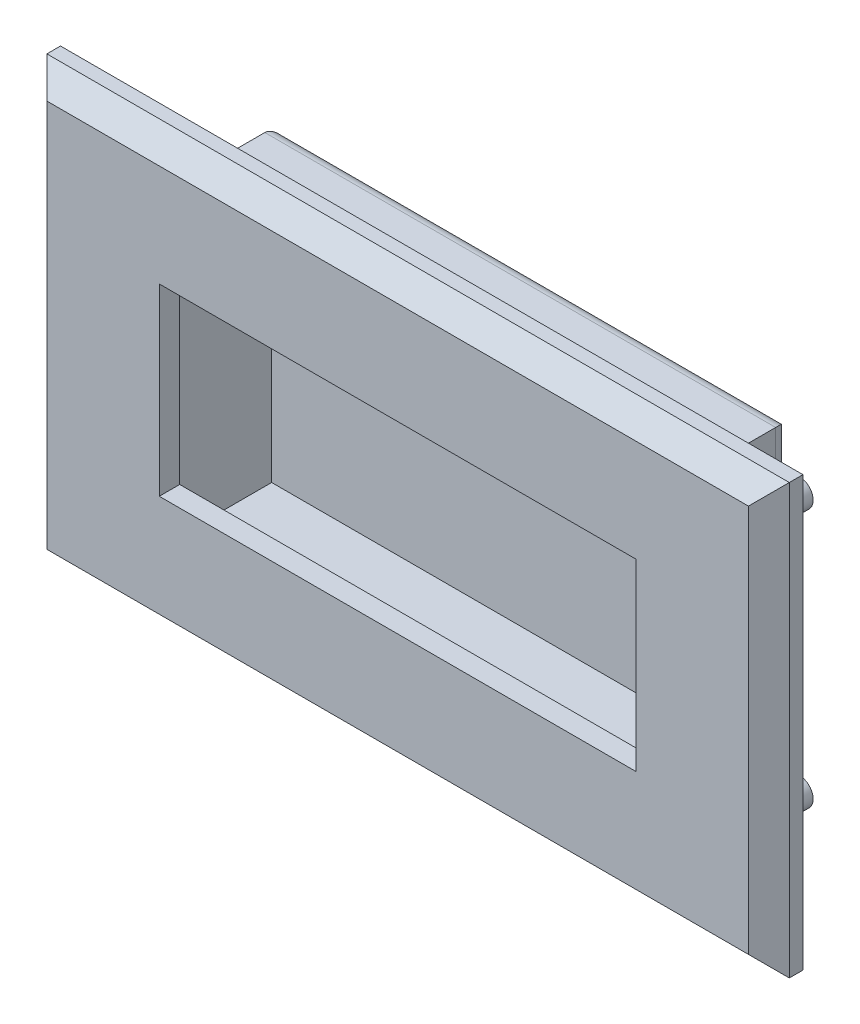
ISO-10303-21;
HEADER;
FILE_DESCRIPTION(('STEP AP214'),'2;1');
FILE_NAME('part.step','',(''),(''),'','','');
FILE_SCHEMA(('AUTOMOTIVE_DESIGN { 1 0 10303 214 1 1 1 1 }'));
ENDSEC;
DATA;
#1=APPLICATION_CONTEXT('core data for automotive mechanical design processes');
#2=APPLICATION_PROTOCOL_DEFINITION('international standard','automotive_design',2000,#1);
#3=PRODUCT_CONTEXT('',#1,'mechanical');
#4=PRODUCT('Part','Part','',(#3));
#5=PRODUCT_RELATED_PRODUCT_CATEGORY('part','',(#4));
#6=PRODUCT_DEFINITION_FORMATION('','',#4);
#7=PRODUCT_DEFINITION_CONTEXT('part definition',#1,'design');
#8=PRODUCT_DEFINITION('design','',#6,#7);
#9=PRODUCT_DEFINITION_SHAPE('','',#8);
#10=(LENGTH_UNIT() NAMED_UNIT(*) SI_UNIT(.MILLI.,.METRE.));
#11=(NAMED_UNIT(*) PLANE_ANGLE_UNIT() SI_UNIT($,.RADIAN.));
#12=(NAMED_UNIT(*) SI_UNIT($,.STERADIAN.) SOLID_ANGLE_UNIT());
#13=UNCERTAINTY_MEASURE_WITH_UNIT(LENGTH_MEASURE(1.E-05),#10,'distance_accuracy_value','');
#14=(GEOMETRIC_REPRESENTATION_CONTEXT(3) GLOBAL_UNCERTAINTY_ASSIGNED_CONTEXT((#13)) GLOBAL_UNIT_ASSIGNED_CONTEXT((#10,
#11,#12)) REPRESENTATION_CONTEXT('',''));
#15=CARTESIAN_POINT('',(0.,0.,0.));
#16=DIRECTION('',(0.,0.,1.));
#17=DIRECTION('',(1.,0.,0.));
#18=AXIS2_PLACEMENT_3D('',#15,#16,#17);
#19=CARTESIAN_POINT('',(35.,-13.5,-13.));
#20=DIRECTION('',(1.,0.,0.));
#21=DIRECTION('',(0.,0.,-1.));
#22=AXIS2_PLACEMENT_3D('',#19,#20,#21);
#23=PLANE('',#22);
#24=DIRECTION('',(0.,1.,0.));
#25=VECTOR('',#24,1.);
#26=CARTESIAN_POINT('',(35.,-13.5,2.));
#27=LINE('',#26,#25);
#28=CARTESIAN_POINT('',(35.,-13.5,2.));
#29=VERTEX_POINT('',#28);
#30=CARTESIAN_POINT('',(35.,13.5,2.));
#31=VERTEX_POINT('',#30);
#32=EDGE_CURVE('E221',#29,#31,#27,.T.);
#33=ORIENTED_EDGE('',*,*,#32,.F.);
#34=DIRECTION('',(0.,0.,1.));
#35=VECTOR('',#34,1.);
#36=CARTESIAN_POINT('',(35.,-13.5,-13.));
#37=LINE('',#36,#35);
#38=CARTESIAN_POINT('',(35.,-13.5,5.));
#39=VERTEX_POINT('',#38);
#40=EDGE_CURVE('E241',#29,#39,#37,.T.);
#41=ORIENTED_EDGE('',*,*,#40,.T.);
#42=DIRECTION('',(0.,1.,0.));
#43=VECTOR('',#42,1.);
#44=CARTESIAN_POINT('',(35.,-13.5,5.));
#45=LINE('',#44,#43);
#46=CARTESIAN_POINT('',(35.,13.5,5.));
#47=VERTEX_POINT('',#46);
#48=EDGE_CURVE('E224',#39,#47,#45,.T.);
#49=ORIENTED_EDGE('',*,*,#48,.T.);
#50=DIRECTION('',(0.,0.,1.));
#51=VECTOR('',#50,1.);
#52=CARTESIAN_POINT('',(35.,13.5,-13.));
#53=LINE('',#52,#51);
#54=EDGE_CURVE('E240',#31,#47,#53,.T.);
#55=ORIENTED_EDGE('',*,*,#54,.F.);
#56=EDGE_LOOP('',(#33,#41,#49,#55));
#57=FACE_BOUND('',#56,.T.);
#58=ADVANCED_FACE('F41',(#57),#23,.F.);
#59=CARTESIAN_POINT('',(-35.,-13.5,-13.));
#60=DIRECTION('',(0.,-1.,0.));
#61=DIRECTION('',(0.,0.,-1.));
#62=AXIS2_PLACEMENT_3D('',#59,#60,#61);
#63=PLANE('',#62);
#64=DIRECTION('',(1.,0.,0.));
#65=VECTOR('',#64,1.);
#66=CARTESIAN_POINT('',(-35.,-13.5,2.));
#67=LINE('',#66,#65);
#68=CARTESIAN_POINT('',(-35.,-13.5,2.));
#69=VERTEX_POINT('',#68);
#70=EDGE_CURVE('E213',#69,#29,#67,.T.);
#71=ORIENTED_EDGE('',*,*,#70,.F.);
#72=DIRECTION('',(0.,0.,1.));
#73=VECTOR('',#72,1.);
#74=CARTESIAN_POINT('',(-35.,-13.5,-13.));
#75=LINE('',#74,#73);
#76=CARTESIAN_POINT('',(-35.,-13.5,5.));
#77=VERTEX_POINT('',#76);
#78=EDGE_CURVE('E245',#69,#77,#75,.T.);
#79=ORIENTED_EDGE('',*,*,#78,.T.);
#80=DIRECTION('',(1.,0.,0.));
#81=VECTOR('',#80,1.);
#82=CARTESIAN_POINT('',(-35.,-13.5,5.));
#83=LINE('',#82,#81);
#84=EDGE_CURVE('E236',#77,#39,#83,.T.);
#85=ORIENTED_EDGE('',*,*,#84,.T.);
#86=ORIENTED_EDGE('',*,*,#40,.F.);
#87=EDGE_LOOP('',(#71,#79,#85,#86));
#88=FACE_BOUND('',#87,.T.);
#89=ADVANCED_FACE('F465',(#88),#63,.F.);
#90=CARTESIAN_POINT('',(-35.,-13.5,-13.));
#91=DIRECTION('',(-1.,0.,0.));
#92=DIRECTION('',(0.,0.,1.));
#93=AXIS2_PLACEMENT_3D('',#90,#91,#92);
#94=PLANE('',#93);
#95=DIRECTION('',(0.,-1.,0.));
#96=VECTOR('',#95,1.);
#97=CARTESIAN_POINT('',(-35.,-13.5,2.));
#98=LINE('',#97,#96);
#99=CARTESIAN_POINT('',(-35.,13.5,2.));
#100=VERTEX_POINT('',#99);
#101=EDGE_CURVE('E208',#100,#69,#98,.T.);
#102=ORIENTED_EDGE('',*,*,#101,.F.);
#103=DIRECTION('',(0.,0.,1.));
#104=VECTOR('',#103,1.);
#105=CARTESIAN_POINT('',(-35.,13.5,-13.));
#106=LINE('',#105,#104);
#107=CARTESIAN_POINT('',(-35.,13.5,5.));
#108=VERTEX_POINT('',#107);
#109=EDGE_CURVE('E248',#100,#108,#106,.T.);
#110=ORIENTED_EDGE('',*,*,#109,.T.);
#111=DIRECTION('',(0.,-1.,0.));
#112=VECTOR('',#111,1.);
#113=CARTESIAN_POINT('',(-35.,-13.5,5.));
#114=LINE('',#113,#112);
#115=EDGE_CURVE('E232',#108,#77,#114,.T.);
#116=ORIENTED_EDGE('',*,*,#115,.T.);
#117=ORIENTED_EDGE('',*,*,#78,.F.);
#118=EDGE_LOOP('',(#102,#110,#116,#117));
#119=FACE_BOUND('',#118,.T.);
#120=ADVANCED_FACE('F471',(#119),#94,.F.);
#121=CARTESIAN_POINT('',(-35.,13.5,-13.));
#122=DIRECTION('',(0.,1.,0.));
#123=DIRECTION('',(0.,0.,1.));
#124=AXIS2_PLACEMENT_3D('',#121,#122,#123);
#125=PLANE('',#124);
#126=DIRECTION('',(-1.,0.,0.));
#127=VECTOR('',#126,1.);
#128=CARTESIAN_POINT('',(-35.,13.5,2.));
#129=LINE('',#128,#127);
#130=EDGE_CURVE('E348',#31,#100,#129,.T.);
#131=ORIENTED_EDGE('',*,*,#130,.F.);
#132=ORIENTED_EDGE('',*,*,#54,.T.);
#133=DIRECTION('',(-1.,0.,0.));
#134=VECTOR('',#133,1.);
#135=CARTESIAN_POINT('',(-35.,13.5,5.));
#136=LINE('',#135,#134);
#137=EDGE_CURVE('E228',#47,#108,#136,.T.);
#138=ORIENTED_EDGE('',*,*,#137,.T.);
#139=ORIENTED_EDGE('',*,*,#109,.F.);
#140=EDGE_LOOP('',(#131,#132,#138,#139));
#141=FACE_BOUND('',#140,.T.);
#142=ADVANCED_FACE('F476',(#141),#125,.F.);
#143=CARTESIAN_POINT('',(54.5,-31.5,5.));
#144=DIRECTION('',(-1.,0.,0.));
#145=DIRECTION('',(0.,0.,1.));
#146=AXIS2_PLACEMENT_3D('',#143,#144,#145);
#147=PLANE('',#146);
#148=DIRECTION('',(0.,0.,-1.));
#149=VECTOR('',#148,1.);
#150=CARTESIAN_POINT('',(54.5,31.5,5.));
#151=LINE('',#150,#149);
#152=CARTESIAN_POINT('',(54.5,31.5,1.99999999999998));
#153=VERTEX_POINT('',#152);
#154=CARTESIAN_POINT('',(54.5,31.5,0.));
#155=VERTEX_POINT('',#154);
#156=EDGE_CURVE('E291',#153,#155,#151,.T.);
#157=ORIENTED_EDGE('',*,*,#156,.F.);
#158=DIRECTION('',(0.,-1.,0.));
#159=VECTOR('',#158,1.);
#160=CARTESIAN_POINT('',(54.5,-31.5,1.99999999999998));
#161=LINE('',#160,#159);
#162=CARTESIAN_POINT('',(54.5,-31.5,1.99999999999998));
#163=VERTEX_POINT('',#162);
#164=EDGE_CURVE('E307',#153,#163,#161,.T.);
#165=ORIENTED_EDGE('',*,*,#164,.T.);
#166=DIRECTION('',(0.,0.,-1.));
#167=VECTOR('',#166,1.);
#168=CARTESIAN_POINT('',(54.5,-31.5,5.));
#169=LINE('',#168,#167);
#170=CARTESIAN_POINT('',(54.5,-31.5,0.));
#171=VERTEX_POINT('',#170);
#172=EDGE_CURVE('E282',#163,#171,#169,.T.);
#173=ORIENTED_EDGE('',*,*,#172,.T.);
#174=DIRECTION('',(0.,1.,0.));
#175=VECTOR('',#174,1.);
#176=CARTESIAN_POINT('',(54.5,-31.5,0.));
#177=LINE('',#176,#175);
#178=EDGE_CURVE('E265',#171,#155,#177,.T.);
#179=ORIENTED_EDGE('',*,*,#178,.T.);
#180=EDGE_LOOP('',(#157,#165,#173,#179));
#181=FACE_BOUND('',#180,.T.);
#182=ADVANCED_FACE('F517',(#181),#147,.F.);
#183=CARTESIAN_POINT('',(-54.5,31.5,5.));
#184=DIRECTION('',(0.,-1.,0.));
#185=DIRECTION('',(0.,0.,-1.));
#186=AXIS2_PLACEMENT_3D('',#183,#184,#185);
#187=PLANE('',#186);
#188=DIRECTION('',(0.,0.,-1.));
#189=VECTOR('',#188,1.);
#190=CARTESIAN_POINT('',(-54.5,31.5,5.));
#191=LINE('',#190,#189);
#192=CARTESIAN_POINT('',(-54.5,31.5,1.99999999999998));
#193=VERTEX_POINT('',#192);
#194=CARTESIAN_POINT('',(-54.5,31.5,0.));
#195=VERTEX_POINT('',#194);
#196=EDGE_CURVE('E288',#193,#195,#191,.T.);
#197=ORIENTED_EDGE('',*,*,#196,.F.);
#198=DIRECTION('',(1.,0.,0.));
#199=VECTOR('',#198,1.);
#200=CARTESIAN_POINT('',(-54.5,31.5,1.99999999999998));
#201=LINE('',#200,#199);
#202=EDGE_CURVE('E317',#193,#153,#201,.T.);
#203=ORIENTED_EDGE('',*,*,#202,.T.);
#204=ORIENTED_EDGE('',*,*,#156,.T.);
#205=DIRECTION('',(-1.,0.,0.));
#206=VECTOR('',#205,1.);
#207=CARTESIAN_POINT('',(-54.5,31.5,0.));
#208=LINE('',#207,#206);
#209=EDGE_CURVE('E269',#155,#195,#208,.T.);
#210=ORIENTED_EDGE('',*,*,#209,.T.);
#211=EDGE_LOOP('',(#197,#203,#204,#210));
#212=FACE_BOUND('',#211,.T.);
#213=ADVANCED_FACE('F513',(#212),#187,.F.);
#214=CARTESIAN_POINT('',(-54.5,-31.5,5.));
#215=DIRECTION('',(1.,0.,0.));
#216=DIRECTION('',(0.,0.,-1.));
#217=AXIS2_PLACEMENT_3D('',#214,#215,#216);
#218=PLANE('',#217);
#219=DIRECTION('',(0.,0.,-1.));
#220=VECTOR('',#219,1.);
#221=CARTESIAN_POINT('',(-54.5,-31.5,5.));
#222=LINE('',#221,#220);
#223=CARTESIAN_POINT('',(-54.5,-31.5,1.99999999999998));
#224=VERTEX_POINT('',#223);
#225=CARTESIAN_POINT('',(-54.5,-31.5,0.));
#226=VERTEX_POINT('',#225);
#227=EDGE_CURVE('E285',#224,#226,#222,.T.);
#228=ORIENTED_EDGE('',*,*,#227,.F.);
#229=DIRECTION('',(0.,1.,0.));
#230=VECTOR('',#229,1.);
#231=CARTESIAN_POINT('',(-54.5,-31.5,1.99999999999998));
#232=LINE('',#231,#230);
#233=EDGE_CURVE('E314',#224,#193,#232,.T.);
#234=ORIENTED_EDGE('',*,*,#233,.T.);
#235=ORIENTED_EDGE('',*,*,#196,.T.);
#236=DIRECTION('',(0.,-1.,0.));
#237=VECTOR('',#236,1.);
#238=CARTESIAN_POINT('',(-54.5,-31.5,0.));
#239=LINE('',#238,#237);
#240=EDGE_CURVE('E274',#195,#226,#239,.T.);
#241=ORIENTED_EDGE('',*,*,#240,.T.);
#242=EDGE_LOOP('',(#228,#234,#235,#241));
#243=FACE_BOUND('',#242,.T.);
#244=ADVANCED_FACE('F509',(#243),#218,.F.);
#245=CARTESIAN_POINT('',(-54.5,-31.5,5.));
#246=DIRECTION('',(0.,1.,0.));
#247=DIRECTION('',(0.,0.,1.));
#248=AXIS2_PLACEMENT_3D('',#245,#246,#247);
#249=PLANE('',#248);
#250=ORIENTED_EDGE('',*,*,#172,.F.);
#251=DIRECTION('',(-1.,0.,0.));
#252=VECTOR('',#251,1.);
#253=CARTESIAN_POINT('',(-54.5,-31.5,1.99999999999998));
#254=LINE('',#253,#252);
#255=EDGE_CURVE('E311',#163,#224,#254,.T.);
#256=ORIENTED_EDGE('',*,*,#255,.T.);
#257=ORIENTED_EDGE('',*,*,#227,.T.);
#258=DIRECTION('',(1.,0.,0.));
#259=VECTOR('',#258,1.);
#260=CARTESIAN_POINT('',(-54.5,-31.5,0.));
#261=LINE('',#260,#259);
#262=EDGE_CURVE('E278',#226,#171,#261,.T.);
#263=ORIENTED_EDGE('',*,*,#262,.T.);
#264=EDGE_LOOP('',(#250,#256,#257,#263));
#265=FACE_BOUND('',#264,.T.);
#266=ADVANCED_FACE('F501',(#265),#249,.F.);
#267=CARTESIAN_POINT('',(0.,0.,5.));
#268=DIRECTION('',(0.,0.,-1.));
#269=DIRECTION('',(-1.,0.,0.));
#270=AXIS2_PLACEMENT_3D('',#267,#268,#269);
#271=PLANE('',#270);
#272=ORIENTED_EDGE('',*,*,#137,.F.);
#273=ORIENTED_EDGE('',*,*,#48,.F.);
#274=ORIENTED_EDGE('',*,*,#84,.F.);
#275=ORIENTED_EDGE('',*,*,#115,.F.);
#276=EDGE_LOOP('',(#272,#273,#274,#275));
#277=FACE_BOUND('',#276,.T.);
#278=DIRECTION('',(1.,0.,0.));
#279=VECTOR('',#278,1.);
#280=CARTESIAN_POINT('',(0.,-28.5,5.));
#281=LINE('',#280,#279);
#282=CARTESIAN_POINT('',(-51.5,-28.5,5.));
#283=VERTEX_POINT('',#282);
#284=CARTESIAN_POINT('',(51.5,-28.5,5.));
#285=VERTEX_POINT('',#284);
#286=EDGE_CURVE('E300',#283,#285,#281,.T.);
#287=ORIENTED_EDGE('',*,*,#286,.T.);
#288=DIRECTION('',(0.,1.,0.));
#289=VECTOR('',#288,1.);
#290=CARTESIAN_POINT('',(51.5,0.,5.));
#291=LINE('',#290,#289);
#292=CARTESIAN_POINT('',(51.5,28.5,5.));
#293=VERTEX_POINT('',#292);
#294=EDGE_CURVE('E303',#285,#293,#291,.T.);
#295=ORIENTED_EDGE('',*,*,#294,.T.);
#296=DIRECTION('',(-1.,0.,0.));
#297=VECTOR('',#296,1.);
#298=CARTESIAN_POINT('',(0.,28.5,5.));
#299=LINE('',#298,#297);
#300=CARTESIAN_POINT('',(-51.5,28.5,5.));
#301=VERTEX_POINT('',#300);
#302=EDGE_CURVE('E294',#293,#301,#299,.T.);
#303=ORIENTED_EDGE('',*,*,#302,.T.);
#304=DIRECTION('',(0.,-1.,0.));
#305=VECTOR('',#304,1.);
#306=CARTESIAN_POINT('',(-51.5,0.,5.));
#307=LINE('',#306,#305);
#308=EDGE_CURVE('E297',#301,#283,#307,.T.);
#309=ORIENTED_EDGE('',*,*,#308,.T.);
#310=EDGE_LOOP('',(#287,#295,#303,#309));
#311=FACE_BOUND('',#310,.T.);
#312=ADVANCED_FACE('F497',(#277,#311),#271,.F.);
#313=CARTESIAN_POINT('',(0.,0.,0.));
#314=DIRECTION('',(0.,0.,-1.));
#315=DIRECTION('',(-1.,0.,0.));
#316=AXIS2_PLACEMENT_3D('',#313,#314,#315);
#317=PLANE('',#316);
#318=CARTESIAN_POINT('',(44.,19.,0.));
#319=DIRECTION('',(0.,0.,-1.));
#320=DIRECTION('',(-1.,0.,0.));
#321=AXIS2_PLACEMENT_3D('',#318,#319,#320);
#322=CIRCLE('',#321,2.);
#323=CARTESIAN_POINT('',(42.,19.,0.));
#324=VERTEX_POINT('',#323);
#325=EDGE_CURVE('E385',#324,#324,#322,.T.);
#326=ORIENTED_EDGE('',*,*,#325,.F.);
#327=EDGE_LOOP('',(#326));
#328=FACE_BOUND('',#327,.T.);
#329=CARTESIAN_POINT('',(44.,-19.,0.));
#330=DIRECTION('',(0.,0.,-1.));
#331=DIRECTION('',(-1.,0.,0.));
#332=AXIS2_PLACEMENT_3D('',#329,#330,#331);
#333=CIRCLE('',#332,2.);
#334=CARTESIAN_POINT('',(42.,-19.,0.));
#335=VERTEX_POINT('',#334);
#336=EDGE_CURVE('E398',#335,#335,#333,.T.);
#337=ORIENTED_EDGE('',*,*,#336,.F.);
#338=EDGE_LOOP('',(#337));
#339=FACE_BOUND('',#338,.T.);
#340=CARTESIAN_POINT('',(-44.,-19.,0.));
#341=DIRECTION('',(0.,0.,-1.));
#342=DIRECTION('',(-1.,0.,0.));
#343=AXIS2_PLACEMENT_3D('',#340,#341,#342);
#344=CIRCLE('',#343,2.);
#345=CARTESIAN_POINT('',(-46.,-19.,0.));
#346=VERTEX_POINT('',#345);
#347=EDGE_CURVE('E405',#346,#346,#344,.T.);
#348=ORIENTED_EDGE('',*,*,#347,.F.);
#349=EDGE_LOOP('',(#348));
#350=FACE_BOUND('',#349,.T.);
#351=CARTESIAN_POINT('',(-44.,19.,0.));
#352=DIRECTION('',(0.,0.,-1.));
#353=DIRECTION('',(-1.,0.,0.));
#354=AXIS2_PLACEMENT_3D('',#351,#352,#353);
#355=CIRCLE('',#354,2.);
#356=CARTESIAN_POINT('',(-46.,19.,0.));
#357=VERTEX_POINT('',#356);
#358=EDGE_CURVE('E413',#357,#357,#355,.T.);
#359=ORIENTED_EDGE('',*,*,#358,.F.);
#360=EDGE_LOOP('',(#359));
#361=FACE_BOUND('',#360,.T.);
#362=DIRECTION('',(0.,-1.,0.));
#363=VECTOR('',#362,1.);
#364=CARTESIAN_POINT('',(37.5,0.,0.));
#365=LINE('',#364,#363);
#366=CARTESIAN_POINT('',(37.5,22.5,0.));
#367=VERTEX_POINT('',#366);
#368=CARTESIAN_POINT('',(37.5,-22.5,0.));
#369=VERTEX_POINT('',#368);
#370=EDGE_CURVE('E344',#367,#369,#365,.T.);
#371=ORIENTED_EDGE('',*,*,#370,.F.);
#372=DIRECTION('',(1.,0.,0.));
#373=VECTOR('',#372,1.);
#374=CARTESIAN_POINT('',(0.,22.5,0.));
#375=LINE('',#374,#373);
#376=CARTESIAN_POINT('',(-37.5,22.5,0.));
#377=VERTEX_POINT('',#376);
#378=EDGE_CURVE('E320',#377,#367,#375,.T.);
#379=ORIENTED_EDGE('',*,*,#378,.F.);
#380=DIRECTION('',(0.,1.,0.));
#381=VECTOR('',#380,1.);
#382=CARTESIAN_POINT('',(-37.5,0.,0.));
#383=LINE('',#382,#381);
#384=CARTESIAN_POINT('',(-37.5,-22.5,0.));
#385=VERTEX_POINT('',#384);
#386=EDGE_CURVE('E336',#385,#377,#383,.T.);
#387=ORIENTED_EDGE('',*,*,#386,.F.);
#388=DIRECTION('',(-1.,0.,0.));
#389=VECTOR('',#388,1.);
#390=CARTESIAN_POINT('',(0.,-22.5,0.));
#391=LINE('',#390,#389);
#392=EDGE_CURVE('E340',#369,#385,#391,.T.);
#393=ORIENTED_EDGE('',*,*,#392,.F.);
#394=EDGE_LOOP('',(#371,#379,#387,#393));
#395=FACE_BOUND('',#394,.T.);
#396=ORIENTED_EDGE('',*,*,#178,.F.);
#397=ORIENTED_EDGE('',*,*,#262,.F.);
#398=ORIENTED_EDGE('',*,*,#240,.F.);
#399=ORIENTED_EDGE('',*,*,#209,.F.);
#400=EDGE_LOOP('',(#396,#397,#398,#399));
#401=FACE_BOUND('',#400,.T.);
#402=ADVANCED_FACE('F500',(#328,#339,#350,#361,#395,#401),#317,.T.);
#403=CARTESIAN_POINT('',(-51.5,0.,5.));
#404=DIRECTION('',(0.707106781186551,0.,-0.707106781186544));
#405=DIRECTION('',(0.,-1.,0.));
#406=AXIS2_PLACEMENT_3D('',#403,#404,#405);
#407=PLANE('',#406);
#408=DIRECTION('',(0.577350269189624,-0.577350269189624,0.577350269189629));
#409=VECTOR('',#408,1.);
#410=CARTESIAN_POINT('',(-34.3333333333334,11.3333333333334,22.1666666666667));
#411=LINE('',#410,#409);
#412=EDGE_CURVE('E326',#193,#301,#411,.T.);
#413=ORIENTED_EDGE('',*,*,#412,.F.);
#414=ORIENTED_EDGE('',*,*,#233,.F.);
#415=DIRECTION('',(0.577350269189624,0.577350269189624,0.577350269189629));
#416=VECTOR('',#415,1.);
#417=CARTESIAN_POINT('',(-42.0000000000001,-19.0000000000001,14.5));
#418=LINE('',#417,#416);
#419=EDGE_CURVE('E270',#283,#224,#418,.F.);
#420=ORIENTED_EDGE('',*,*,#419,.F.);
#421=ORIENTED_EDGE('',*,*,#308,.F.);
#422=EDGE_LOOP('',(#413,#414,#420,#421));
#423=FACE_BOUND('',#422,.T.);
#424=ADVANCED_FACE('F505',(#423),#407,.F.);
#425=CARTESIAN_POINT('',(0.,-28.5,5.));
#426=DIRECTION('',(0.,0.707106781186551,-0.707106781186544));
#427=DIRECTION('',(1.,0.,0.));
#428=AXIS2_PLACEMENT_3D('',#425,#426,#427);
#429=PLANE('',#428);
#430=ORIENTED_EDGE('',*,*,#419,.T.);
#431=ORIENTED_EDGE('',*,*,#255,.F.);
#432=DIRECTION('',(-0.577350269189624,0.577350269189624,0.577350269189629));
#433=VECTOR('',#432,1.);
#434=CARTESIAN_POINT('',(34.3333333333334,-11.3333333333334,22.1666666666667));
#435=LINE('',#434,#433);
#436=EDGE_CURVE('E323',#285,#163,#435,.F.);
#437=ORIENTED_EDGE('',*,*,#436,.F.);
#438=ORIENTED_EDGE('',*,*,#286,.F.);
#439=EDGE_LOOP('',(#430,#431,#437,#438));
#440=FACE_BOUND('',#439,.T.);
#441=ADVANCED_FACE('F535',(#440),#429,.F.);
#442=CARTESIAN_POINT('',(0.,28.5,5.));
#443=DIRECTION('',(0.,-0.707106781186551,-0.707106781186544));
#444=DIRECTION('',(-1.,0.,0.));
#445=AXIS2_PLACEMENT_3D('',#442,#443,#444);
#446=PLANE('',#445);
#447=ORIENTED_EDGE('',*,*,#412,.T.);
#448=ORIENTED_EDGE('',*,*,#302,.F.);
#449=DIRECTION('',(0.577350269189624,0.577350269189624,-0.577350269189629));
#450=VECTOR('',#449,1.);
#451=CARTESIAN_POINT('',(34.3333333333334,11.3333333333334,22.1666666666667));
#452=LINE('',#451,#450);
#453=EDGE_CURVE('E256',#153,#293,#452,.F.);
#454=ORIENTED_EDGE('',*,*,#453,.F.);
#455=ORIENTED_EDGE('',*,*,#202,.F.);
#456=EDGE_LOOP('',(#447,#448,#454,#455));
#457=FACE_BOUND('',#456,.T.);
#458=ADVANCED_FACE('F528',(#457),#446,.F.);
#459=CARTESIAN_POINT('',(51.5,0.,5.));
#460=DIRECTION('',(-0.707106781186551,0.,-0.707106781186544));
#461=DIRECTION('',(0.,1.,0.));
#462=AXIS2_PLACEMENT_3D('',#459,#460,#461);
#463=PLANE('',#462);
#464=ORIENTED_EDGE('',*,*,#436,.T.);
#465=ORIENTED_EDGE('',*,*,#164,.F.);
#466=ORIENTED_EDGE('',*,*,#453,.T.);
#467=ORIENTED_EDGE('',*,*,#294,.F.);
#468=EDGE_LOOP('',(#464,#465,#466,#467));
#469=FACE_BOUND('',#468,.T.);
#470=ADVANCED_FACE('F495',(#469),#463,.F.);
#471=CARTESIAN_POINT('',(37.5,-22.5,-15.));
#472=DIRECTION('',(1.,0.,0.));
#473=DIRECTION('',(0.,0.,-1.));
#474=AXIS2_PLACEMENT_3D('',#471,#472,#473);
#475=PLANE('',#474);
#476=DIRECTION('',(0.,0.,1.));
#477=VECTOR('',#476,1.);
#478=CARTESIAN_POINT('',(37.5,-22.5,-15.));
#479=LINE('',#478,#477);
#480=CARTESIAN_POINT('',(37.5,-22.5,-13.));
#481=VERTEX_POINT('',#480);
#482=EDGE_CURVE('E253',#481,#369,#479,.T.);
#483=ORIENTED_EDGE('',*,*,#482,.F.);
#484=DIRECTION('',(0.,1.,0.));
#485=VECTOR('',#484,1.);
#486=CARTESIAN_POINT('',(37.5,-22.5,-13.));
#487=LINE('',#486,#485);
#488=CARTESIAN_POINT('',(37.5,22.5,-13.));
#489=VERTEX_POINT('',#488);
#490=EDGE_CURVE('E351',#481,#489,#487,.T.);
#491=ORIENTED_EDGE('',*,*,#490,.T.);
#492=DIRECTION('',(0.,0.,1.));
#493=VECTOR('',#492,1.);
#494=CARTESIAN_POINT('',(37.5,22.5,-15.));
#495=LINE('',#494,#493);
#496=EDGE_CURVE('E244',#489,#367,#495,.T.);
#497=ORIENTED_EDGE('',*,*,#496,.T.);
#498=ORIENTED_EDGE('',*,*,#370,.T.);
#499=EDGE_LOOP('',(#483,#491,#497,#498));
#500=FACE_BOUND('',#499,.T.);
#501=ADVANCED_FACE('F487',(#500),#475,.T.);
#502=CARTESIAN_POINT('',(-37.5,-22.5,-15.));
#503=DIRECTION('',(0.,-1.,0.));
#504=DIRECTION('',(0.,0.,-1.));
#505=AXIS2_PLACEMENT_3D('',#502,#503,#504);
#506=PLANE('',#505);
#507=DIRECTION('',(0.,0.,1.));
#508=VECTOR('',#507,1.);
#509=CARTESIAN_POINT('',(-37.5,-22.5,-15.));
#510=LINE('',#509,#508);
#511=CARTESIAN_POINT('',(-37.5,-22.5,-13.));
#512=VERTEX_POINT('',#511);
#513=EDGE_CURVE('E257',#512,#385,#510,.T.);
#514=ORIENTED_EDGE('',*,*,#513,.F.);
#515=DIRECTION('',(1.,0.,0.));
#516=VECTOR('',#515,1.);
#517=CARTESIAN_POINT('',(-37.5,-22.5,-13.));
#518=LINE('',#517,#516);
#519=EDGE_CURVE('E11',#512,#481,#518,.T.);
#520=ORIENTED_EDGE('',*,*,#519,.T.);
#521=ORIENTED_EDGE('',*,*,#482,.T.);
#522=ORIENTED_EDGE('',*,*,#392,.T.);
#523=EDGE_LOOP('',(#514,#520,#521,#522));
#524=FACE_BOUND('',#523,.T.);
#525=ADVANCED_FACE('F483',(#524),#506,.T.);
#526=CARTESIAN_POINT('',(-37.5,-22.5,-15.));
#527=DIRECTION('',(-1.,0.,0.));
#528=DIRECTION('',(0.,0.,1.));
#529=AXIS2_PLACEMENT_3D('',#526,#527,#528);
#530=PLANE('',#529);
#531=DIRECTION('',(0.,0.,1.));
#532=VECTOR('',#531,1.);
#533=CARTESIAN_POINT('',(-37.5,22.5,-15.));
#534=LINE('',#533,#532);
#535=CARTESIAN_POINT('',(-37.5,22.5,-13.));
#536=VERTEX_POINT('',#535);
#537=EDGE_CURVE('E260',#536,#377,#534,.T.);
#538=ORIENTED_EDGE('',*,*,#537,.F.);
#539=DIRECTION('',(0.,-1.,0.));
#540=VECTOR('',#539,1.);
#541=CARTESIAN_POINT('',(-37.5,-22.5,-13.));
#542=LINE('',#541,#540);
#543=EDGE_CURVE('E51',#536,#512,#542,.T.);
#544=ORIENTED_EDGE('',*,*,#543,.T.);
#545=ORIENTED_EDGE('',*,*,#513,.T.);
#546=ORIENTED_EDGE('',*,*,#386,.T.);
#547=EDGE_LOOP('',(#538,#544,#545,#546));
#548=FACE_BOUND('',#547,.T.);
#549=ADVANCED_FACE('F486',(#548),#530,.T.);
#550=CARTESIAN_POINT('',(-37.5,22.5,-15.));
#551=DIRECTION('',(0.,1.,0.));
#552=DIRECTION('',(0.,0.,1.));
#553=AXIS2_PLACEMENT_3D('',#550,#551,#552);
#554=PLANE('',#553);
#555=ORIENTED_EDGE('',*,*,#496,.F.);
#556=DIRECTION('',(-1.,0.,0.));
#557=VECTOR('',#556,1.);
#558=CARTESIAN_POINT('',(-37.5,22.5,-13.));
#559=LINE('',#558,#557);
#560=EDGE_CURVE('E66',#489,#536,#559,.T.);
#561=ORIENTED_EDGE('',*,*,#560,.T.);
#562=ORIENTED_EDGE('',*,*,#537,.T.);
#563=ORIENTED_EDGE('',*,*,#378,.T.);
#564=EDGE_LOOP('',(#555,#561,#562,#563));
#565=FACE_BOUND('',#564,.T.);
#566=ADVANCED_FACE('F481',(#565),#554,.T.);
#567=CARTESIAN_POINT('',(0.,0.,-15.));
#568=DIRECTION('',(0.,0.,-1.));
#569=DIRECTION('',(-1.,0.,0.));
#570=AXIS2_PLACEMENT_3D('',#567,#568,#569);
#571=PLANE('',#570);
#572=DIRECTION('',(-1.,0.,0.));
#573=VECTOR('',#572,1.);
#574=CARTESIAN_POINT('',(0.,20.5,-15.));
#575=LINE('',#574,#573);
#576=CARTESIAN_POINT('',(-35.5,20.5,-15.));
#577=VERTEX_POINT('',#576);
#578=CARTESIAN_POINT('',(35.5,20.5,-15.));
#579=VERTEX_POINT('',#578);
#580=EDGE_CURVE('E361',#577,#579,#575,.F.);
#581=ORIENTED_EDGE('',*,*,#580,.T.);
#582=DIRECTION('',(0.,1.,0.));
#583=VECTOR('',#582,1.);
#584=CARTESIAN_POINT('',(35.5,0.,-15.));
#585=LINE('',#584,#583);
#586=CARTESIAN_POINT('',(35.5,-20.5,-15.));
#587=VERTEX_POINT('',#586);
#588=EDGE_CURVE('E364',#579,#587,#585,.F.);
#589=ORIENTED_EDGE('',*,*,#588,.T.);
#590=DIRECTION('',(1.,0.,0.));
#591=VECTOR('',#590,1.);
#592=CARTESIAN_POINT('',(0.,-20.5,-15.));
#593=LINE('',#592,#591);
#594=CARTESIAN_POINT('',(-35.5,-20.5,-15.));
#595=VERTEX_POINT('',#594);
#596=EDGE_CURVE('E355',#587,#595,#593,.F.);
#597=ORIENTED_EDGE('',*,*,#596,.T.);
#598=DIRECTION('',(0.,-1.,0.));
#599=VECTOR('',#598,1.);
#600=CARTESIAN_POINT('',(-35.5,0.,-15.));
#601=LINE('',#600,#599);
#602=EDGE_CURVE('E358',#595,#577,#601,.F.);
#603=ORIENTED_EDGE('',*,*,#602,.T.);
#604=EDGE_LOOP('',(#581,#589,#597,#603));
#605=FACE_BOUND('',#604,.T.);
#606=ADVANCED_FACE('F478',(#605),#571,.T.);
#607=CARTESIAN_POINT('',(0.,0.,2.));
#608=DIRECTION('',(0.,0.,-1.));
#609=DIRECTION('',(-1.,0.,0.));
#610=AXIS2_PLACEMENT_3D('',#607,#608,#609);
#611=PLANE('',#610);
#612=DIRECTION('',(0.,1.,0.));
#613=VECTOR('',#612,1.);
#614=CARTESIAN_POINT('',(36.5,-21.5,2.));
#615=LINE('',#614,#613);
#616=CARTESIAN_POINT('',(36.5,-21.5,2.));
#617=VERTEX_POINT('',#616);
#618=CARTESIAN_POINT('',(36.5,21.5,2.));
#619=VERTEX_POINT('',#618);
#620=EDGE_CURVE('E185',#617,#619,#615,.T.);
#621=ORIENTED_EDGE('',*,*,#620,.F.);
#622=DIRECTION('',(1.,0.,0.));
#623=VECTOR('',#622,1.);
#624=CARTESIAN_POINT('',(-36.5,-21.5,2.));
#625=LINE('',#624,#623);
#626=CARTESIAN_POINT('',(-36.5,-21.5,2.));
#627=VERTEX_POINT('',#626);
#628=EDGE_CURVE('E427',#627,#617,#625,.T.);
#629=ORIENTED_EDGE('',*,*,#628,.F.);
#630=DIRECTION('',(0.,-1.,0.));
#631=VECTOR('',#630,1.);
#632=CARTESIAN_POINT('',(-36.5,-21.5,2.));
#633=LINE('',#632,#631);
#634=CARTESIAN_POINT('',(-36.5,21.5,2.));
#635=VERTEX_POINT('',#634);
#636=EDGE_CURVE('E186',#635,#627,#633,.T.);
#637=ORIENTED_EDGE('',*,*,#636,.F.);
#638=DIRECTION('',(-1.,0.,0.));
#639=VECTOR('',#638,1.);
#640=CARTESIAN_POINT('',(-36.5,21.5,2.));
#641=LINE('',#640,#639);
#642=EDGE_CURVE('E180',#619,#635,#641,.T.);
#643=ORIENTED_EDGE('',*,*,#642,.F.);
#644=EDGE_LOOP('',(#621,#629,#637,#643));
#645=FACE_BOUND('',#644,.T.);
#646=ORIENTED_EDGE('',*,*,#32,.T.);
#647=ORIENTED_EDGE('',*,*,#130,.T.);
#648=ORIENTED_EDGE('',*,*,#101,.T.);
#649=ORIENTED_EDGE('',*,*,#70,.T.);
#650=EDGE_LOOP('',(#646,#647,#648,#649));
#651=FACE_BOUND('',#650,.T.);
#652=ADVANCED_FACE('F182',(#645,#651),#611,.T.);
#653=CARTESIAN_POINT('',(36.5,-21.5,2.));
#654=DIRECTION('',(-1.,0.,0.));
#655=DIRECTION('',(0.,0.,1.));
#656=AXIS2_PLACEMENT_3D('',#653,#654,#655);
#657=PLANE('',#656);
#658=DIRECTION('',(0.,1.,0.));
#659=VECTOR('',#658,1.);
#660=CARTESIAN_POINT('',(36.5,-21.5,-13.));
#661=LINE('',#660,#659);
#662=CARTESIAN_POINT('',(36.5,-21.5,-13.));
#663=VERTEX_POINT('',#662);
#664=CARTESIAN_POINT('',(36.5,21.5,-13.));
#665=VERTEX_POINT('',#664);
#666=EDGE_CURVE('E421',#663,#665,#661,.T.);
#667=ORIENTED_EDGE('',*,*,#666,.F.);
#668=DIRECTION('',(0.,0.,-1.));
#669=VECTOR('',#668,1.);
#670=CARTESIAN_POINT('',(36.5,-21.5,2.));
#671=LINE('',#670,#669);
#672=EDGE_CURVE('E201',#617,#663,#671,.T.);
#673=ORIENTED_EDGE('',*,*,#672,.F.);
#674=ORIENTED_EDGE('',*,*,#620,.T.);
#675=DIRECTION('',(0.,0.,-1.));
#676=VECTOR('',#675,1.);
#677=CARTESIAN_POINT('',(36.5,21.5,2.));
#678=LINE('',#677,#676);
#679=EDGE_CURVE('E198',#619,#665,#678,.T.);
#680=ORIENTED_EDGE('',*,*,#679,.T.);
#681=EDGE_LOOP('',(#667,#673,#674,#680));
#682=FACE_BOUND('',#681,.T.);
#683=ADVANCED_FACE('F197',(#682),#657,.T.);
#684=CARTESIAN_POINT('',(-36.5,21.5,2.));
#685=DIRECTION('',(0.,-1.,0.));
#686=DIRECTION('',(0.,0.,-1.));
#687=AXIS2_PLACEMENT_3D('',#684,#685,#686);
#688=PLANE('',#687);
#689=DIRECTION('',(-1.,0.,0.));
#690=VECTOR('',#689,1.);
#691=CARTESIAN_POINT('',(-36.5,21.5,-13.));
#692=LINE('',#691,#690);
#693=CARTESIAN_POINT('',(-36.5,21.5,-13.));
#694=VERTEX_POINT('',#693);
#695=EDGE_CURVE('E206',#665,#694,#692,.T.);
#696=ORIENTED_EDGE('',*,*,#695,.F.);
#697=ORIENTED_EDGE('',*,*,#679,.F.);
#698=ORIENTED_EDGE('',*,*,#642,.T.);
#699=DIRECTION('',(0.,0.,-1.));
#700=VECTOR('',#699,1.);
#701=CARTESIAN_POINT('',(-36.5,21.5,2.));
#702=LINE('',#701,#700);
#703=EDGE_CURVE('E209',#635,#694,#702,.T.);
#704=ORIENTED_EDGE('',*,*,#703,.T.);
#705=EDGE_LOOP('',(#696,#697,#698,#704));
#706=FACE_BOUND('',#705,.T.);
#707=ADVANCED_FACE('F205',(#706),#688,.T.);
#708=CARTESIAN_POINT('',(-36.5,-21.5,2.));
#709=DIRECTION('',(1.,0.,0.));
#710=DIRECTION('',(0.,0.,-1.));
#711=AXIS2_PLACEMENT_3D('',#708,#709,#710);
#712=PLANE('',#711);
#713=DIRECTION('',(0.,-1.,0.));
#714=VECTOR('',#713,1.);
#715=CARTESIAN_POINT('',(-36.5,-21.5,-13.));
#716=LINE('',#715,#714);
#717=CARTESIAN_POINT('',(-36.5,-21.5,-13.));
#718=VERTEX_POINT('',#717);
#719=EDGE_CURVE('E434',#694,#718,#716,.T.);
#720=ORIENTED_EDGE('',*,*,#719,.F.);
#721=ORIENTED_EDGE('',*,*,#703,.F.);
#722=ORIENTED_EDGE('',*,*,#636,.T.);
#723=DIRECTION('',(0.,0.,-1.));
#724=VECTOR('',#723,1.);
#725=CARTESIAN_POINT('',(-36.5,-21.5,2.));
#726=LINE('',#725,#724);
#727=EDGE_CURVE('E215',#627,#718,#726,.T.);
#728=ORIENTED_EDGE('',*,*,#727,.T.);
#729=EDGE_LOOP('',(#720,#721,#722,#728));
#730=FACE_BOUND('',#729,.T.);
#731=ADVANCED_FACE('F446',(#730),#712,.T.);
#732=CARTESIAN_POINT('',(-36.5,-21.5,2.));
#733=DIRECTION('',(0.,1.,0.));
#734=DIRECTION('',(0.,0.,1.));
#735=AXIS2_PLACEMENT_3D('',#732,#733,#734);
#736=PLANE('',#735);
#737=DIRECTION('',(1.,0.,0.));
#738=VECTOR('',#737,1.);
#739=CARTESIAN_POINT('',(-36.5,-21.5,-13.));
#740=LINE('',#739,#738);
#741=EDGE_CURVE('E203',#718,#663,#740,.T.);
#742=ORIENTED_EDGE('',*,*,#741,.F.);
#743=ORIENTED_EDGE('',*,*,#727,.F.);
#744=ORIENTED_EDGE('',*,*,#628,.T.);
#745=ORIENTED_EDGE('',*,*,#672,.T.);
#746=EDGE_LOOP('',(#742,#743,#744,#745));
#747=FACE_BOUND('',#746,.T.);
#748=ADVANCED_FACE('F448',(#747),#736,.T.);
#749=CARTESIAN_POINT('',(0.,0.,-13.));
#750=DIRECTION('',(0.,0.,-1.));
#751=DIRECTION('',(-1.,0.,0.));
#752=AXIS2_PLACEMENT_3D('',#749,#750,#751);
#753=PLANE('',#752);
#754=ORIENTED_EDGE('',*,*,#666,.T.);
#755=ORIENTED_EDGE('',*,*,#695,.T.);
#756=ORIENTED_EDGE('',*,*,#719,.T.);
#757=ORIENTED_EDGE('',*,*,#741,.T.);
#758=EDGE_LOOP('',(#754,#755,#756,#757));
#759=FACE_BOUND('',#758,.T.);
#760=ADVANCED_FACE('F450',(#759),#753,.F.);
#761=CARTESIAN_POINT('',(-44.,19.,-10.));
#762=DIRECTION('',(0.,0.,1.));
#763=DIRECTION('',(1.,0.,0.));
#764=AXIS2_PLACEMENT_3D('',#761,#762,#763);
#765=CYLINDRICAL_SURFACE('',#764,2.);
#766=CARTESIAN_POINT('',(-44.,19.,-10.));
#767=DIRECTION('',(0.,0.,-1.));
#768=DIRECTION('',(-1.,0.,0.));
#769=AXIS2_PLACEMENT_3D('',#766,#767,#768);
#770=CIRCLE('',#769,2.);
#771=CARTESIAN_POINT('',(-46.,19.,-10.));
#772=VERTEX_POINT('',#771);
#773=EDGE_CURVE('E417',#772,#772,#770,.T.);
#774=ORIENTED_EDGE('',*,*,#773,.F.);
#775=EDGE_LOOP('',(#774));
#776=FACE_BOUND('',#775,.T.);
#777=ORIENTED_EDGE('',*,*,#358,.T.);
#778=EDGE_LOOP('',(#777));
#779=FACE_BOUND('',#778,.T.);
#780=ADVANCED_FACE('F452',(#776,#779),#765,.T.);
#781=CARTESIAN_POINT('',(-44.,19.,-10.));
#782=DIRECTION('',(0.,0.,-1.));
#783=DIRECTION('',(-1.,0.,0.));
#784=AXIS2_PLACEMENT_3D('',#781,#782,#783);
#785=PLANE('',#784);
#786=ORIENTED_EDGE('',*,*,#773,.T.);
#787=EDGE_LOOP('',(#786));
#788=FACE_BOUND('',#787,.T.);
#789=ADVANCED_FACE('F458',(#788),#785,.T.);
#790=CARTESIAN_POINT('',(-44.,-19.,-10.));
#791=DIRECTION('',(0.,0.,1.));
#792=DIRECTION('',(1.,0.,0.));
#793=AXIS2_PLACEMENT_3D('',#790,#791,#792);
#794=CYLINDRICAL_SURFACE('',#793,2.);
#795=CARTESIAN_POINT('',(-44.,-19.,-10.));
#796=DIRECTION('',(0.,0.,-1.));
#797=DIRECTION('',(-1.,0.,0.));
#798=AXIS2_PLACEMENT_3D('',#795,#796,#797);
#799=CIRCLE('',#798,2.);
#800=CARTESIAN_POINT('',(-46.,-19.,-10.));
#801=VERTEX_POINT('',#800);
#802=EDGE_CURVE('E409',#801,#801,#799,.T.);
#803=ORIENTED_EDGE('',*,*,#802,.F.);
#804=EDGE_LOOP('',(#803));
#805=FACE_BOUND('',#804,.T.);
#806=ORIENTED_EDGE('',*,*,#347,.T.);
#807=EDGE_LOOP('',(#806));
#808=FACE_BOUND('',#807,.T.);
#809=ADVANCED_FACE('F617',(#805,#808),#794,.T.);
#810=CARTESIAN_POINT('',(-44.,-19.,-10.));
#811=DIRECTION('',(0.,0.,-1.));
#812=DIRECTION('',(-1.,0.,0.));
#813=AXIS2_PLACEMENT_3D('',#810,#811,#812);
#814=PLANE('',#813);
#815=ORIENTED_EDGE('',*,*,#802,.T.);
#816=EDGE_LOOP('',(#815));
#817=FACE_BOUND('',#816,.T.);
#818=ADVANCED_FACE('F613',(#817),#814,.T.);
#819=CARTESIAN_POINT('',(44.,-19.,-10.));
#820=DIRECTION('',(0.,0.,1.));
#821=DIRECTION('',(1.,0.,0.));
#822=AXIS2_PLACEMENT_3D('',#819,#820,#821);
#823=CYLINDRICAL_SURFACE('',#822,2.);
#824=CARTESIAN_POINT('',(44.,-19.,-10.));
#825=DIRECTION('',(0.,0.,-1.));
#826=DIRECTION('',(-1.,0.,0.));
#827=AXIS2_PLACEMENT_3D('',#824,#825,#826);
#828=CIRCLE('',#827,2.);
#829=CARTESIAN_POINT('',(42.,-19.,-10.));
#830=VERTEX_POINT('',#829);
#831=EDGE_CURVE('E401',#830,#830,#828,.T.);
#832=ORIENTED_EDGE('',*,*,#831,.F.);
#833=EDGE_LOOP('',(#832));
#834=FACE_BOUND('',#833,.T.);
#835=ORIENTED_EDGE('',*,*,#336,.T.);
#836=EDGE_LOOP('',(#835));
#837=FACE_BOUND('',#836,.T.);
#838=ADVANCED_FACE('F609',(#834,#837),#823,.T.);
#839=CARTESIAN_POINT('',(44.,-19.,-10.));
#840=DIRECTION('',(0.,0.,-1.));
#841=DIRECTION('',(-1.,0.,0.));
#842=AXIS2_PLACEMENT_3D('',#839,#840,#841);
#843=PLANE('',#842);
#844=ORIENTED_EDGE('',*,*,#831,.T.);
#845=EDGE_LOOP('',(#844));
#846=FACE_BOUND('',#845,.T.);
#847=ADVANCED_FACE('F603',(#846),#843,.T.);
#848=CARTESIAN_POINT('',(44.,19.,-10.));
#849=DIRECTION('',(0.,0.,1.));
#850=DIRECTION('',(1.,0.,0.));
#851=AXIS2_PLACEMENT_3D('',#848,#849,#850);
#852=CYLINDRICAL_SURFACE('',#851,2.);
#853=CARTESIAN_POINT('',(44.,19.,-10.));
#854=DIRECTION('',(0.,0.,-1.));
#855=DIRECTION('',(-1.,0.,0.));
#856=AXIS2_PLACEMENT_3D('',#853,#854,#855);
#857=CIRCLE('',#856,2.);
#858=CARTESIAN_POINT('',(42.,19.,-10.));
#859=VERTEX_POINT('',#858);
#860=EDGE_CURVE('E392',#859,#859,#857,.T.);
#861=ORIENTED_EDGE('',*,*,#860,.F.);
#862=EDGE_LOOP('',(#861));
#863=FACE_BOUND('',#862,.T.);
#864=ORIENTED_EDGE('',*,*,#325,.T.);
#865=EDGE_LOOP('',(#864));
#866=FACE_BOUND('',#865,.T.);
#867=ADVANCED_FACE('F564',(#863,#866),#852,.T.);
#868=CARTESIAN_POINT('',(44.,19.,-10.));
#869=DIRECTION('',(0.,0.,-1.));
#870=DIRECTION('',(-1.,0.,0.));
#871=AXIS2_PLACEMENT_3D('',#868,#869,#870);
#872=PLANE('',#871);
#873=ORIENTED_EDGE('',*,*,#860,.T.);
#874=EDGE_LOOP('',(#873));
#875=FACE_BOUND('',#874,.T.);
#876=ADVANCED_FACE('F559',(#875),#872,.T.);
#877=CARTESIAN_POINT('',(-35.5,-22.5,-13.));
#878=DIRECTION('',(0.,-1.,0.));
#879=DIRECTION('',(0.,0.,-1.));
#880=AXIS2_PLACEMENT_3D('',#877,#878,#879);
#881=CYLINDRICAL_SURFACE('',#880,2.);
#882=CARTESIAN_POINT('',(-35.5,20.5,-13.));
#883=DIRECTION('',(-0.707106781186547,-0.707106781186547,0.));
#884=DIRECTION('',(0.707106781186547,-0.707106781186547,0.));
#885=AXIS2_PLACEMENT_3D('',#882,#883,#884);
#886=ELLIPSE('',#885,2.82842712474619,2.);
#887=EDGE_CURVE('E377',#577,#536,#886,.F.);
#888=ORIENTED_EDGE('',*,*,#887,.F.);
#889=ORIENTED_EDGE('',*,*,#602,.F.);
#890=CARTESIAN_POINT('',(-35.5,-20.5,-13.));
#891=DIRECTION('',(0.707106781186547,-0.707106781186547,0.));
#892=DIRECTION('',(0.707106781186547,0.707106781186547,0.));
#893=AXIS2_PLACEMENT_3D('',#890,#891,#892);
#894=ELLIPSE('',#893,2.82842712474619,2.);
#895=EDGE_CURVE('E45',#512,#595,#894,.T.);
#896=ORIENTED_EDGE('',*,*,#895,.F.);
#897=ORIENTED_EDGE('',*,*,#543,.F.);
#898=EDGE_LOOP('',(#888,#889,#896,#897));
#899=FACE_BOUND('',#898,.T.);
#900=ADVANCED_FACE('F43',(#899),#881,.T.);
#901=CARTESIAN_POINT('',(-37.5,-20.5,-13.));
#902=DIRECTION('',(1.,0.,0.));
#903=DIRECTION('',(0.,0.,-1.));
#904=AXIS2_PLACEMENT_3D('',#901,#902,#903);
#905=CYLINDRICAL_SURFACE('',#904,2.);
#906=ORIENTED_EDGE('',*,*,#895,.T.);
#907=ORIENTED_EDGE('',*,*,#596,.F.);
#908=CARTESIAN_POINT('',(35.5,-20.5,-13.));
#909=DIRECTION('',(0.707106781186547,0.707106781186547,0.));
#910=DIRECTION('',(0.707106781186547,-0.707106781186547,0.));
#911=AXIS2_PLACEMENT_3D('',#908,#909,#910);
#912=ELLIPSE('',#911,2.82842712474619,2.);
#913=EDGE_CURVE('E375',#481,#587,#912,.T.);
#914=ORIENTED_EDGE('',*,*,#913,.F.);
#915=ORIENTED_EDGE('',*,*,#519,.F.);
#916=EDGE_LOOP('',(#906,#907,#914,#915));
#917=FACE_BOUND('',#916,.T.);
#918=ADVANCED_FACE('F554',(#917),#905,.T.);
#919=CARTESIAN_POINT('',(-37.5,20.5,-13.));
#920=DIRECTION('',(-1.,0.,0.));
#921=DIRECTION('',(0.,0.,1.));
#922=AXIS2_PLACEMENT_3D('',#919,#920,#921);
#923=CYLINDRICAL_SURFACE('',#922,2.);
#924=ORIENTED_EDGE('',*,*,#887,.T.);
#925=ORIENTED_EDGE('',*,*,#560,.F.);
#926=CARTESIAN_POINT('',(35.5,20.5,-13.));
#927=DIRECTION('',(-0.707106781186547,0.707106781186547,0.));
#928=DIRECTION('',(-0.707106781186547,-0.707106781186547,0.));
#929=AXIS2_PLACEMENT_3D('',#926,#927,#928);
#930=ELLIPSE('',#929,2.82842712474619,2.);
#931=EDGE_CURVE('E372',#579,#489,#930,.F.);
#932=ORIENTED_EDGE('',*,*,#931,.F.);
#933=ORIENTED_EDGE('',*,*,#580,.F.);
#934=EDGE_LOOP('',(#924,#925,#932,#933));
#935=FACE_BOUND('',#934,.T.);
#936=ADVANCED_FACE('F551',(#935),#923,.T.);
#937=CARTESIAN_POINT('',(35.5,-22.5,-13.));
#938=DIRECTION('',(0.,1.,0.));
#939=DIRECTION('',(0.,0.,1.));
#940=AXIS2_PLACEMENT_3D('',#937,#938,#939);
#941=CYLINDRICAL_SURFACE('',#940,2.);
#942=ORIENTED_EDGE('',*,*,#913,.T.);
#943=ORIENTED_EDGE('',*,*,#588,.F.);
#944=ORIENTED_EDGE('',*,*,#931,.T.);
#945=ORIENTED_EDGE('',*,*,#490,.F.);
#946=EDGE_LOOP('',(#942,#943,#944,#945));
#947=FACE_BOUND('',#946,.T.);
#948=ADVANCED_FACE('F548',(#947),#941,.T.);
#949=CLOSED_SHELL('',(#58,#89,#120,#142,#182,#213,#244,#266,#312,#402,#424,#441,#458,#470,#501,
#525,#549,#566,#606,#652,#683,#707,#731,#748,#760,#780,#789,#809,#818,#838,#847,#867,#876,#900,
#918,#936,#948));
#950=MANIFOLD_SOLID_BREP('B2',#949);
#951=ADVANCED_BREP_SHAPE_REPRESENTATION('',(#18,#950),#14);
#952=SHAPE_DEFINITION_REPRESENTATION(#9,#951);
ENDSEC;
END-ISO-10303-21;
